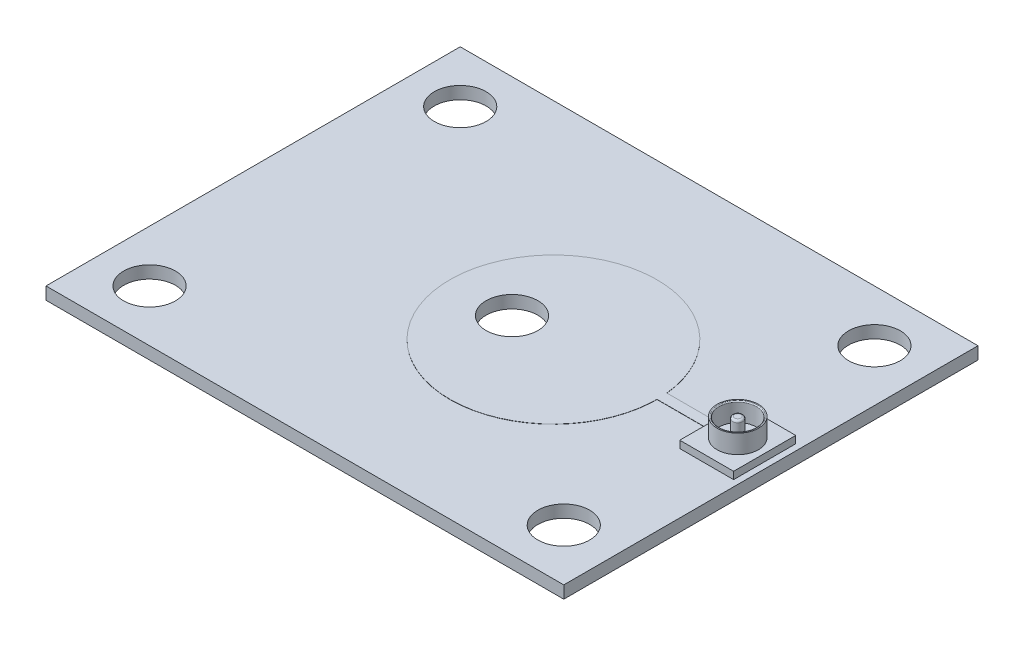
ISO-10303-21;
HEADER;
FILE_DESCRIPTION(('STEP AP214'),'2;1');
FILE_NAME('part.step','',(''),(''),'','','');
FILE_SCHEMA(('AUTOMOTIVE_DESIGN { 1 0 10303 214 1 1 1 1 }'));
ENDSEC;
DATA;
#1=APPLICATION_CONTEXT('core data for automotive mechanical design processes');
#2=APPLICATION_PROTOCOL_DEFINITION('international standard','automotive_design',2000,#1);
#3=PRODUCT_CONTEXT('',#1,'mechanical');
#4=PRODUCT('Part','Part','',(#3));
#5=PRODUCT_RELATED_PRODUCT_CATEGORY('part','',(#4));
#6=PRODUCT_DEFINITION_FORMATION('','',#4);
#7=PRODUCT_DEFINITION_CONTEXT('part definition',#1,'design');
#8=PRODUCT_DEFINITION('design','',#6,#7);
#9=PRODUCT_DEFINITION_SHAPE('','',#8);
#10=(LENGTH_UNIT() NAMED_UNIT(*) SI_UNIT(.MILLI.,.METRE.));
#11=(NAMED_UNIT(*) PLANE_ANGLE_UNIT() SI_UNIT($,.RADIAN.));
#12=(NAMED_UNIT(*) SI_UNIT($,.STERADIAN.) SOLID_ANGLE_UNIT());
#13=UNCERTAINTY_MEASURE_WITH_UNIT(LENGTH_MEASURE(1.E-05),#10,'distance_accuracy_value','');
#14=(GEOMETRIC_REPRESENTATION_CONTEXT(3) GLOBAL_UNCERTAINTY_ASSIGNED_CONTEXT((#13)) GLOBAL_UNIT_ASSIGNED_CONTEXT((#10,
#11,#12)) REPRESENTATION_CONTEXT('',''));
#15=CARTESIAN_POINT('',(0.,0.,0.));
#16=DIRECTION('',(0.,0.,1.));
#17=DIRECTION('',(1.,0.,0.));
#18=AXIS2_PLACEMENT_3D('',#15,#16,#17);
#19=CARTESIAN_POINT('',(0.,0.6,0.));
#20=DIRECTION('',(0.,-1.,0.));
#21=DIRECTION('',(0.,0.,-1.));
#22=AXIS2_PLACEMENT_3D('',#19,#20,#21);
#23=PLANE('',#22);
#24=CARTESIAN_POINT('',(-10.,0.6,7.5));
#25=DIRECTION('',(0.,1.,0.));
#26=DIRECTION('',(0.,0.,-1.));
#27=AXIS2_PLACEMENT_3D('',#24,#25,#26);
#28=CIRCLE('',#27,1.25);
#29=CARTESIAN_POINT('',(-10.,0.6,6.25));
#30=VERTEX_POINT('',#29);
#31=EDGE_CURVE('E224',#30,#30,#28,.T.);
#32=ORIENTED_EDGE('',*,*,#31,.F.);
#33=EDGE_LOOP('',(#32));
#34=FACE_BOUND('',#33,.T.);
#35=CARTESIAN_POINT('',(10.,0.6,7.5));
#36=DIRECTION('',(0.,1.,0.));
#37=DIRECTION('',(0.,0.,1.));
#38=AXIS2_PLACEMENT_3D('',#35,#36,#37);
#39=CIRCLE('',#38,1.25);
#40=CARTESIAN_POINT('',(10.,0.6,8.75));
#41=VERTEX_POINT('',#40);
#42=EDGE_CURVE('E238',#41,#41,#39,.T.);
#43=ORIENTED_EDGE('',*,*,#42,.F.);
#44=EDGE_LOOP('',(#43));
#45=FACE_BOUND('',#44,.T.);
#46=CARTESIAN_POINT('',(10.,0.6,-7.5));
#47=DIRECTION('',(0.,1.,0.));
#48=DIRECTION('',(0.,0.,-1.));
#49=AXIS2_PLACEMENT_3D('',#46,#47,#48);
#50=CIRCLE('',#49,1.25);
#51=CARTESIAN_POINT('',(10.,0.6,-8.75));
#52=VERTEX_POINT('',#51);
#53=EDGE_CURVE('E232',#52,#52,#50,.T.);
#54=ORIENTED_EDGE('',*,*,#53,.F.);
#55=EDGE_LOOP('',(#54));
#56=FACE_BOUND('',#55,.T.);
#57=CARTESIAN_POINT('',(-10.,0.6,-7.5));
#58=DIRECTION('',(0.,1.,0.));
#59=DIRECTION('',(0.,0.,1.));
#60=AXIS2_PLACEMENT_3D('',#57,#58,#59);
#61=CIRCLE('',#60,1.25);
#62=CARTESIAN_POINT('',(-10.,0.6,-6.25));
#63=VERTEX_POINT('',#62);
#64=EDGE_CURVE('E228',#63,#63,#61,.T.);
#65=ORIENTED_EDGE('',*,*,#64,.F.);
#66=EDGE_LOOP('',(#65));
#67=FACE_BOUND('',#66,.T.);
#68=DIRECTION('',(0.,0.,-1.));
#69=VECTOR('',#68,1.);
#70=CARTESIAN_POINT('',(12.5,0.6,10.));
#71=LINE('',#70,#69);
#72=CARTESIAN_POINT('',(12.5,0.6,10.));
#73=VERTEX_POINT('',#72);
#74=CARTESIAN_POINT('',(12.5,0.6,-10.));
#75=VERTEX_POINT('',#74);
#76=EDGE_CURVE('E252',#73,#75,#71,.T.);
#77=ORIENTED_EDGE('',*,*,#76,.T.);
#78=DIRECTION('',(-1.,0.,0.));
#79=VECTOR('',#78,1.);
#80=CARTESIAN_POINT('',(-12.5,0.6,-10.));
#81=LINE('',#80,#79);
#82=CARTESIAN_POINT('',(-12.5,0.6,-10.));
#83=VERTEX_POINT('',#82);
#84=EDGE_CURVE('E255',#75,#83,#81,.T.);
#85=ORIENTED_EDGE('',*,*,#84,.T.);
#86=DIRECTION('',(0.,0.,1.));
#87=VECTOR('',#86,1.);
#88=CARTESIAN_POINT('',(-12.5,0.6,10.));
#89=LINE('',#88,#87);
#90=CARTESIAN_POINT('',(-12.5,0.6,10.));
#91=VERTEX_POINT('',#90);
#92=EDGE_CURVE('E258',#83,#91,#89,.T.);
#93=ORIENTED_EDGE('',*,*,#92,.T.);
#94=DIRECTION('',(1.,0.,0.));
#95=VECTOR('',#94,1.);
#96=CARTESIAN_POINT('',(-12.5,0.6,10.));
#97=LINE('',#96,#95);
#98=EDGE_CURVE('E260',#91,#73,#97,.T.);
#99=ORIENTED_EDGE('',*,*,#98,.T.);
#100=EDGE_LOOP('',(#77,#85,#93,#99));
#101=FACE_BOUND('',#100,.T.);
#102=DIRECTION('',(0.,0.,1.));
#103=VECTOR('',#102,1.);
#104=CARTESIAN_POINT('',(9.6,0.6,1.5));
#105=LINE('',#104,#103);
#106=CARTESIAN_POINT('',(9.6,0.6,0.));
#107=VERTEX_POINT('',#106);
#108=CARTESIAN_POINT('',(9.6,0.6,1.5));
#109=VERTEX_POINT('',#108);
#110=EDGE_CURVE('E60',#107,#109,#105,.T.);
#111=ORIENTED_EDGE('',*,*,#110,.F.);
#112=DIRECTION('',(-1.,0.,0.));
#113=VECTOR('',#112,1.);
#114=CARTESIAN_POINT('',(0.,0.6,0.));
#115=LINE('',#114,#113);
#116=CARTESIAN_POINT('',(7.,0.6,0.));
#117=VERTEX_POINT('',#116);
#118=EDGE_CURVE('E164',#107,#117,#115,.T.);
#119=ORIENTED_EDGE('',*,*,#118,.T.);
#120=DIRECTION('',(-0.0299999999999982,0.,0.999549898704412));
#121=VECTOR('',#120,1.);
#122=CARTESIAN_POINT('',(6.9937,0.6,0.209905478727914));
#123=LINE('',#122,#121);
#124=CARTESIAN_POINT('',(6.991,0.6,0.299864969611323));
#125=VERTEX_POINT('',#124);
#126=EDGE_CURVE('E140',#117,#125,#123,.T.);
#127=ORIENTED_EDGE('',*,*,#126,.T.);
#128=CARTESIAN_POINT('',(2.,0.6,0.));
#129=DIRECTION('',(0.,1.,0.));
#130=DIRECTION('',(0.,0.,1.));
#131=AXIS2_PLACEMENT_3D('',#128,#129,#130);
#132=CIRCLE('',#131,5.);
#133=CARTESIAN_POINT('',(6.9749371855331,0.6,-0.5));
#134=VERTEX_POINT('',#133);
#135=EDGE_CURVE('E169',#134,#125,#132,.T.);
#136=ORIENTED_EDGE('',*,*,#135,.F.);
#137=DIRECTION('',(-1.,0.,0.));
#138=VECTOR('',#137,1.);
#139=CARTESIAN_POINT('',(0.,0.6,-0.5));
#140=LINE('',#139,#138);
#141=CARTESIAN_POINT('',(9.6,0.6,-0.5));
#142=VERTEX_POINT('',#141);
#143=EDGE_CURVE('E166',#142,#134,#140,.T.);
#144=ORIENTED_EDGE('',*,*,#143,.F.);
#145=CARTESIAN_POINT('',(9.6,0.6,-1.5));
#146=VERTEX_POINT('',#145);
#147=EDGE_CURVE('E202',#146,#142,#105,.T.);
#148=ORIENTED_EDGE('',*,*,#147,.F.);
#149=DIRECTION('',(-1.,0.,0.));
#150=VECTOR('',#149,1.);
#151=CARTESIAN_POINT('',(12.2,0.6,-1.5));
#152=LINE('',#151,#150);
#153=CARTESIAN_POINT('',(12.2,0.6,-1.5));
#154=VERTEX_POINT('',#153);
#155=EDGE_CURVE('E195',#154,#146,#152,.T.);
#156=ORIENTED_EDGE('',*,*,#155,.F.);
#157=DIRECTION('',(0.,0.,-1.));
#158=VECTOR('',#157,1.);
#159=CARTESIAN_POINT('',(12.2,0.6,1.5));
#160=LINE('',#159,#158);
#161=CARTESIAN_POINT('',(12.2,0.6,1.5));
#162=VERTEX_POINT('',#161);
#163=EDGE_CURVE('E208',#162,#154,#160,.T.);
#164=ORIENTED_EDGE('',*,*,#163,.F.);
#165=DIRECTION('',(1.,0.,0.));
#166=VECTOR('',#165,1.);
#167=CARTESIAN_POINT('',(12.2,0.6,1.5));
#168=LINE('',#167,#166);
#169=EDGE_CURVE('E205',#109,#162,#168,.T.);
#170=ORIENTED_EDGE('',*,*,#169,.F.);
#171=EDGE_LOOP('',(#111,#119,#127,#136,#144,#148,#156,#164,#170));
#172=FACE_BOUND('',#171,.T.);
#173=ADVANCED_FACE('F37',(#34,#45,#56,#67,#101,#172),#23,.F.);
#174=CARTESIAN_POINT('',(12.5,0.6,10.));
#175=DIRECTION('',(-1.,0.,0.));
#176=DIRECTION('',(0.,0.,1.));
#177=AXIS2_PLACEMENT_3D('',#174,#175,#176);
#178=PLANE('',#177);
#179=DIRECTION('',(0.,0.,-1.));
#180=VECTOR('',#179,1.);
#181=CARTESIAN_POINT('',(12.5,0.,10.));
#182=LINE('',#181,#180);
#183=CARTESIAN_POINT('',(12.5,0.,10.));
#184=VERTEX_POINT('',#183);
#185=CARTESIAN_POINT('',(12.5,0.,-10.));
#186=VERTEX_POINT('',#185);
#187=EDGE_CURVE('E249',#184,#186,#182,.T.);
#188=ORIENTED_EDGE('',*,*,#187,.T.);
#189=DIRECTION('',(0.,-1.,0.));
#190=VECTOR('',#189,1.);
#191=CARTESIAN_POINT('',(12.5,0.6,-10.));
#192=LINE('',#191,#190);
#193=EDGE_CURVE('E190',#75,#186,#192,.T.);
#194=ORIENTED_EDGE('',*,*,#193,.F.);
#195=ORIENTED_EDGE('',*,*,#76,.F.);
#196=DIRECTION('',(0.,-1.,0.));
#197=VECTOR('',#196,1.);
#198=CARTESIAN_POINT('',(12.5,0.6,10.));
#199=LINE('',#198,#197);
#200=EDGE_CURVE('E262',#73,#184,#199,.T.);
#201=ORIENTED_EDGE('',*,*,#200,.T.);
#202=EDGE_LOOP('',(#188,#194,#195,#201));
#203=FACE_BOUND('',#202,.T.);
#204=ADVANCED_FACE('F302',(#203),#178,.F.);
#205=CARTESIAN_POINT('',(-12.5,0.6,-10.));
#206=DIRECTION('',(0.,0.,1.));
#207=DIRECTION('',(1.,0.,0.));
#208=AXIS2_PLACEMENT_3D('',#205,#206,#207);
#209=PLANE('',#208);
#210=DIRECTION('',(-1.,0.,0.));
#211=VECTOR('',#210,1.);
#212=CARTESIAN_POINT('',(-12.5,0.,-10.));
#213=LINE('',#212,#211);
#214=CARTESIAN_POINT('',(-12.5,0.,-10.));
#215=VERTEX_POINT('',#214);
#216=EDGE_CURVE('E265',#186,#215,#213,.T.);
#217=ORIENTED_EDGE('',*,*,#216,.T.);
#218=DIRECTION('',(0.,-1.,0.));
#219=VECTOR('',#218,1.);
#220=CARTESIAN_POINT('',(-12.5,0.6,-10.));
#221=LINE('',#220,#219);
#222=EDGE_CURVE('E275',#83,#215,#221,.T.);
#223=ORIENTED_EDGE('',*,*,#222,.F.);
#224=ORIENTED_EDGE('',*,*,#84,.F.);
#225=ORIENTED_EDGE('',*,*,#193,.T.);
#226=EDGE_LOOP('',(#217,#223,#224,#225));
#227=FACE_BOUND('',#226,.T.);
#228=ADVANCED_FACE('F308',(#227),#209,.F.);
#229=CARTESIAN_POINT('',(-12.5,0.6,10.));
#230=DIRECTION('',(1.,0.,0.));
#231=DIRECTION('',(0.,0.,-1.));
#232=AXIS2_PLACEMENT_3D('',#229,#230,#231);
#233=PLANE('',#232);
#234=DIRECTION('',(0.,0.,1.));
#235=VECTOR('',#234,1.);
#236=CARTESIAN_POINT('',(-12.5,0.,10.));
#237=LINE('',#236,#235);
#238=CARTESIAN_POINT('',(-12.5,0.,10.));
#239=VERTEX_POINT('',#238);
#240=EDGE_CURVE('E267',#215,#239,#237,.T.);
#241=ORIENTED_EDGE('',*,*,#240,.T.);
#242=DIRECTION('',(0.,-1.,0.));
#243=VECTOR('',#242,1.);
#244=CARTESIAN_POINT('',(-12.5,0.6,10.));
#245=LINE('',#244,#243);
#246=EDGE_CURVE('E272',#91,#239,#245,.T.);
#247=ORIENTED_EDGE('',*,*,#246,.F.);
#248=ORIENTED_EDGE('',*,*,#92,.F.);
#249=ORIENTED_EDGE('',*,*,#222,.T.);
#250=EDGE_LOOP('',(#241,#247,#248,#249));
#251=FACE_BOUND('',#250,.T.);
#252=ADVANCED_FACE('F324',(#251),#233,.F.);
#253=CARTESIAN_POINT('',(-12.5,0.6,10.));
#254=DIRECTION('',(0.,0.,-1.));
#255=DIRECTION('',(-1.,0.,0.));
#256=AXIS2_PLACEMENT_3D('',#253,#254,#255);
#257=PLANE('',#256);
#258=DIRECTION('',(1.,0.,0.));
#259=VECTOR('',#258,1.);
#260=CARTESIAN_POINT('',(-12.5,0.,10.));
#261=LINE('',#260,#259);
#262=EDGE_CURVE('E256',#239,#184,#261,.T.);
#263=ORIENTED_EDGE('',*,*,#262,.T.);
#264=ORIENTED_EDGE('',*,*,#200,.F.);
#265=ORIENTED_EDGE('',*,*,#98,.F.);
#266=ORIENTED_EDGE('',*,*,#246,.T.);
#267=EDGE_LOOP('',(#263,#264,#265,#266));
#268=FACE_BOUND('',#267,.T.);
#269=ADVANCED_FACE('F320',(#268),#257,.F.);
#270=CARTESIAN_POINT('',(0.,0.,0.));
#271=DIRECTION('',(0.,-1.,0.));
#272=DIRECTION('',(0.,0.,-1.));
#273=AXIS2_PLACEMENT_3D('',#270,#271,#272);
#274=PLANE('',#273);
#275=CARTESIAN_POINT('',(-10.,0.,7.5));
#276=DIRECTION('',(0.,1.,0.));
#277=DIRECTION('',(0.,0.,-1.));
#278=AXIS2_PLACEMENT_3D('',#275,#276,#277);
#279=CIRCLE('',#278,1.25);
#280=CARTESIAN_POINT('',(-10.,0.,6.25));
#281=VERTEX_POINT('',#280);
#282=EDGE_CURVE('E241',#281,#281,#279,.T.);
#283=ORIENTED_EDGE('',*,*,#282,.T.);
#284=EDGE_LOOP('',(#283));
#285=FACE_BOUND('',#284,.T.);
#286=CARTESIAN_POINT('',(10.,0.,7.5));
#287=DIRECTION('',(0.,1.,0.));
#288=DIRECTION('',(0.,0.,1.));
#289=AXIS2_PLACEMENT_3D('',#286,#287,#288);
#290=CIRCLE('',#289,1.25);
#291=CARTESIAN_POINT('',(10.,0.,8.75));
#292=VERTEX_POINT('',#291);
#293=EDGE_CURVE('E235',#292,#292,#290,.T.);
#294=ORIENTED_EDGE('',*,*,#293,.T.);
#295=EDGE_LOOP('',(#294));
#296=FACE_BOUND('',#295,.T.);
#297=CARTESIAN_POINT('',(10.,0.,-7.5));
#298=DIRECTION('',(0.,1.,0.));
#299=DIRECTION('',(0.,0.,-1.));
#300=AXIS2_PLACEMENT_3D('',#297,#298,#299);
#301=CIRCLE('',#300,1.25);
#302=CARTESIAN_POINT('',(10.,0.,-8.75));
#303=VERTEX_POINT('',#302);
#304=EDGE_CURVE('E229',#303,#303,#301,.T.);
#305=ORIENTED_EDGE('',*,*,#304,.T.);
#306=EDGE_LOOP('',(#305));
#307=FACE_BOUND('',#306,.T.);
#308=CARTESIAN_POINT('',(0.,0.,0.));
#309=DIRECTION('',(0.,1.,0.));
#310=DIRECTION('',(0.,0.,1.));
#311=AXIS2_PLACEMENT_3D('',#308,#309,#310);
#312=CIRCLE('',#311,1.25);
#313=CARTESIAN_POINT('',(0.,0.,1.25));
#314=VERTEX_POINT('',#313);
#315=EDGE_CURVE('E225',#314,#314,#312,.T.);
#316=ORIENTED_EDGE('',*,*,#315,.T.);
#317=EDGE_LOOP('',(#316));
#318=FACE_BOUND('',#317,.T.);
#319=CARTESIAN_POINT('',(-10.,0.,-7.5));
#320=DIRECTION('',(0.,1.,0.));
#321=DIRECTION('',(0.,0.,1.));
#322=AXIS2_PLACEMENT_3D('',#319,#320,#321);
#323=CIRCLE('',#322,1.25);
#324=CARTESIAN_POINT('',(-10.,0.,-6.25));
#325=VERTEX_POINT('',#324);
#326=EDGE_CURVE('E246',#325,#325,#323,.T.);
#327=ORIENTED_EDGE('',*,*,#326,.T.);
#328=EDGE_LOOP('',(#327));
#329=FACE_BOUND('',#328,.T.);
#330=ORIENTED_EDGE('',*,*,#187,.F.);
#331=ORIENTED_EDGE('',*,*,#262,.F.);
#332=ORIENTED_EDGE('',*,*,#240,.F.);
#333=ORIENTED_EDGE('',*,*,#216,.F.);
#334=EDGE_LOOP('',(#330,#331,#332,#333));
#335=FACE_BOUND('',#334,.T.);
#336=ADVANCED_FACE('F317',(#285,#296,#307,#318,#329,#335),#274,.T.);
#337=CARTESIAN_POINT('',(-10.,0.,-7.5));
#338=DIRECTION('',(0.,1.,0.));
#339=DIRECTION('',(0.,0.,1.));
#340=AXIS2_PLACEMENT_3D('',#337,#338,#339);
#341=CYLINDRICAL_SURFACE('',#340,1.25);
#342=ORIENTED_EDGE('',*,*,#326,.F.);
#343=EDGE_LOOP('',(#342));
#344=FACE_BOUND('',#343,.T.);
#345=ORIENTED_EDGE('',*,*,#64,.T.);
#346=EDGE_LOOP('',(#345));
#347=FACE_BOUND('',#346,.T.);
#348=ADVANCED_FACE('F315',(#344,#347),#341,.F.);
#349=CARTESIAN_POINT('',(0.,0.,0.));
#350=DIRECTION('',(0.,1.,0.));
#351=DIRECTION('',(0.,0.,1.));
#352=AXIS2_PLACEMENT_3D('',#349,#350,#351);
#353=CYLINDRICAL_SURFACE('',#352,1.25);
#354=ORIENTED_EDGE('',*,*,#315,.F.);
#355=EDGE_LOOP('',(#354));
#356=FACE_BOUND('',#355,.T.);
#357=CARTESIAN_POINT('',(0.,0.61,0.));
#358=DIRECTION('',(0.,1.,0.));
#359=DIRECTION('',(0.,0.,1.));
#360=AXIS2_PLACEMENT_3D('',#357,#358,#359);
#361=CIRCLE('',#360,1.25);
#362=CARTESIAN_POINT('',(0.,0.61,1.25));
#363=VERTEX_POINT('',#362);
#364=EDGE_CURVE('E150',#363,#363,#361,.F.);
#365=ORIENTED_EDGE('',*,*,#364,.F.);
#366=EDGE_LOOP('',(#365));
#367=FACE_BOUND('',#366,.T.);
#368=ADVANCED_FACE('F375',(#356,#367),#353,.F.);
#369=CARTESIAN_POINT('',(10.,0.,-7.5));
#370=DIRECTION('',(0.,1.,0.));
#371=DIRECTION('',(0.,0.,1.));
#372=AXIS2_PLACEMENT_3D('',#369,#370,#371);
#373=CYLINDRICAL_SURFACE('',#372,1.25);
#374=ORIENTED_EDGE('',*,*,#304,.F.);
#375=EDGE_LOOP('',(#374));
#376=FACE_BOUND('',#375,.T.);
#377=ORIENTED_EDGE('',*,*,#53,.T.);
#378=EDGE_LOOP('',(#377));
#379=FACE_BOUND('',#378,.T.);
#380=ADVANCED_FACE('F378',(#376,#379),#373,.F.);
#381=CARTESIAN_POINT('',(10.,0.,7.5));
#382=DIRECTION('',(0.,1.,0.));
#383=DIRECTION('',(0.,0.,1.));
#384=AXIS2_PLACEMENT_3D('',#381,#382,#383);
#385=CYLINDRICAL_SURFACE('',#384,1.25);
#386=ORIENTED_EDGE('',*,*,#293,.F.);
#387=EDGE_LOOP('',(#386));
#388=FACE_BOUND('',#387,.T.);
#389=ORIENTED_EDGE('',*,*,#42,.T.);
#390=EDGE_LOOP('',(#389));
#391=FACE_BOUND('',#390,.T.);
#392=ADVANCED_FACE('F382',(#388,#391),#385,.F.);
#393=CARTESIAN_POINT('',(-10.,0.,7.5));
#394=DIRECTION('',(0.,1.,0.));
#395=DIRECTION('',(0.,0.,1.));
#396=AXIS2_PLACEMENT_3D('',#393,#394,#395);
#397=CYLINDRICAL_SURFACE('',#396,1.25);
#398=ORIENTED_EDGE('',*,*,#282,.F.);
#399=EDGE_LOOP('',(#398));
#400=FACE_BOUND('',#399,.T.);
#401=ORIENTED_EDGE('',*,*,#31,.T.);
#402=EDGE_LOOP('',(#401));
#403=FACE_BOUND('',#402,.T.);
#404=ADVANCED_FACE('F374',(#400,#403),#397,.F.);
#405=CARTESIAN_POINT('',(9.6,0.95,1.5));
#406=DIRECTION('',(1.,0.,0.));
#407=DIRECTION('',(0.,0.,-1.));
#408=AXIS2_PLACEMENT_3D('',#405,#406,#407);
#409=PLANE('',#408);
#410=DIRECTION('',(0.,0.,-1.));
#411=VECTOR('',#410,1.);
#412=CARTESIAN_POINT('',(9.6,0.61,0.));
#413=LINE('',#412,#411);
#414=CARTESIAN_POINT('',(9.6,0.61,0.));
#415=VERTEX_POINT('',#414);
#416=CARTESIAN_POINT('',(9.6,0.61,-0.5));
#417=VERTEX_POINT('',#416);
#418=EDGE_CURVE('E154',#415,#417,#413,.T.);
#419=ORIENTED_EDGE('',*,*,#418,.F.);
#420=DIRECTION('',(0.,-1.,0.));
#421=VECTOR('',#420,1.);
#422=CARTESIAN_POINT('',(9.6,0.61,0.));
#423=LINE('',#422,#421);
#424=EDGE_CURVE('E144',#415,#107,#423,.T.);
#425=ORIENTED_EDGE('',*,*,#424,.T.);
#426=ORIENTED_EDGE('',*,*,#110,.T.);
#427=DIRECTION('',(0.,-1.,0.));
#428=VECTOR('',#427,1.);
#429=CARTESIAN_POINT('',(9.6,0.95,1.5));
#430=LINE('',#429,#428);
#431=CARTESIAN_POINT('',(9.6,0.95,1.5));
#432=VERTEX_POINT('',#431);
#433=EDGE_CURVE('E221',#432,#109,#430,.T.);
#434=ORIENTED_EDGE('',*,*,#433,.F.);
#435=DIRECTION('',(0.,0.,1.));
#436=VECTOR('',#435,1.);
#437=CARTESIAN_POINT('',(9.6,0.95,1.5));
#438=LINE('',#437,#436);
#439=CARTESIAN_POINT('',(9.6,0.95,-1.5));
#440=VERTEX_POINT('',#439);
#441=EDGE_CURVE('E191',#440,#432,#438,.T.);
#442=ORIENTED_EDGE('',*,*,#441,.F.);
#443=DIRECTION('',(0.,-1.,0.));
#444=VECTOR('',#443,1.);
#445=CARTESIAN_POINT('',(9.6,0.95,-1.5));
#446=LINE('',#445,#444);
#447=EDGE_CURVE('E201',#440,#146,#446,.T.);
#448=ORIENTED_EDGE('',*,*,#447,.T.);
#449=ORIENTED_EDGE('',*,*,#147,.T.);
#450=DIRECTION('',(0.,-1.,0.));
#451=VECTOR('',#450,1.);
#452=CARTESIAN_POINT('',(9.6,0.61,-0.5));
#453=LINE('',#452,#451);
#454=EDGE_CURVE('E175',#417,#142,#453,.T.);
#455=ORIENTED_EDGE('',*,*,#454,.F.);
#456=EDGE_LOOP('',(#419,#425,#426,#434,#442,#448,#449,#455));
#457=FACE_BOUND('',#456,.T.);
#458=ADVANCED_FACE('F350',(#457),#409,.F.);
#459=CARTESIAN_POINT('',(12.2,0.95,1.5));
#460=DIRECTION('',(0.,0.,-1.));
#461=DIRECTION('',(-1.,0.,0.));
#462=AXIS2_PLACEMENT_3D('',#459,#460,#461);
#463=PLANE('',#462);
#464=ORIENTED_EDGE('',*,*,#169,.T.);
#465=DIRECTION('',(0.,-1.,0.));
#466=VECTOR('',#465,1.);
#467=CARTESIAN_POINT('',(12.2,0.95,1.5));
#468=LINE('',#467,#466);
#469=CARTESIAN_POINT('',(12.2,0.95,1.5));
#470=VERTEX_POINT('',#469);
#471=EDGE_CURVE('E218',#470,#162,#468,.T.);
#472=ORIENTED_EDGE('',*,*,#471,.F.);
#473=DIRECTION('',(1.,0.,0.));
#474=VECTOR('',#473,1.);
#475=CARTESIAN_POINT('',(12.2,0.95,1.5));
#476=LINE('',#475,#474);
#477=EDGE_CURVE('E194',#432,#470,#476,.T.);
#478=ORIENTED_EDGE('',*,*,#477,.F.);
#479=ORIENTED_EDGE('',*,*,#433,.T.);
#480=EDGE_LOOP('',(#464,#472,#478,#479));
#481=FACE_BOUND('',#480,.T.);
#482=ADVANCED_FACE('F348',(#481),#463,.F.);
#483=CARTESIAN_POINT('',(12.2,0.95,1.5));
#484=DIRECTION('',(-1.,0.,0.));
#485=DIRECTION('',(0.,0.,1.));
#486=AXIS2_PLACEMENT_3D('',#483,#484,#485);
#487=PLANE('',#486);
#488=ORIENTED_EDGE('',*,*,#163,.T.);
#489=DIRECTION('',(0.,-1.,0.));
#490=VECTOR('',#489,1.);
#491=CARTESIAN_POINT('',(12.2,0.95,-1.5));
#492=LINE('',#491,#490);
#493=CARTESIAN_POINT('',(12.2,0.95,-1.5));
#494=VERTEX_POINT('',#493);
#495=EDGE_CURVE('E215',#494,#154,#492,.T.);
#496=ORIENTED_EDGE('',*,*,#495,.F.);
#497=DIRECTION('',(0.,0.,-1.));
#498=VECTOR('',#497,1.);
#499=CARTESIAN_POINT('',(12.2,0.95,1.5));
#500=LINE('',#499,#498);
#501=EDGE_CURVE('E197',#470,#494,#500,.T.);
#502=ORIENTED_EDGE('',*,*,#501,.F.);
#503=ORIENTED_EDGE('',*,*,#471,.T.);
#504=EDGE_LOOP('',(#488,#496,#502,#503));
#505=FACE_BOUND('',#504,.T.);
#506=ADVANCED_FACE('F361',(#505),#487,.F.);
#507=CARTESIAN_POINT('',(12.2,0.95,-1.5));
#508=DIRECTION('',(0.,0.,1.));
#509=DIRECTION('',(1.,0.,0.));
#510=AXIS2_PLACEMENT_3D('',#507,#508,#509);
#511=PLANE('',#510);
#512=ORIENTED_EDGE('',*,*,#155,.T.);
#513=ORIENTED_EDGE('',*,*,#447,.F.);
#514=DIRECTION('',(-1.,0.,0.));
#515=VECTOR('',#514,1.);
#516=CARTESIAN_POINT('',(12.2,0.95,-1.5));
#517=LINE('',#516,#515);
#518=EDGE_CURVE('E199',#494,#440,#517,.T.);
#519=ORIENTED_EDGE('',*,*,#518,.F.);
#520=ORIENTED_EDGE('',*,*,#495,.T.);
#521=EDGE_LOOP('',(#512,#513,#519,#520));
#522=FACE_BOUND('',#521,.T.);
#523=ADVANCED_FACE('F358',(#522),#511,.F.);
#524=CARTESIAN_POINT('',(0.,0.95,0.));
#525=DIRECTION('',(0.,1.,0.));
#526=DIRECTION('',(0.,0.,1.));
#527=AXIS2_PLACEMENT_3D('',#524,#525,#526);
#528=PLANE('',#527);
#529=CARTESIAN_POINT('',(10.9,0.95,0.));
#530=DIRECTION('',(0.,1.,0.));
#531=DIRECTION('',(0.,0.,1.));
#532=AXIS2_PLACEMENT_3D('',#529,#530,#531);
#533=CIRCLE('',#532,1.);
#534=CARTESIAN_POINT('',(10.9,0.95,1.));
#535=VERTEX_POINT('',#534);
#536=EDGE_CURVE('E186',#535,#535,#533,.T.);
#537=ORIENTED_EDGE('',*,*,#536,.F.);
#538=EDGE_LOOP('',(#537));
#539=FACE_BOUND('',#538,.T.);
#540=ORIENTED_EDGE('',*,*,#441,.T.);
#541=ORIENTED_EDGE('',*,*,#477,.T.);
#542=ORIENTED_EDGE('',*,*,#501,.T.);
#543=ORIENTED_EDGE('',*,*,#518,.T.);
#544=EDGE_LOOP('',(#540,#541,#542,#543));
#545=FACE_BOUND('',#544,.T.);
#546=ADVANCED_FACE('F353',(#539,#545),#528,.T.);
#547=CARTESIAN_POINT('',(10.9,1.85,0.));
#548=DIRECTION('',(0.,-1.,0.));
#549=DIRECTION('',(0.,0.,-1.));
#550=AXIS2_PLACEMENT_3D('',#547,#548,#549);
#551=CYLINDRICAL_SURFACE('',#550,1.);
#552=CARTESIAN_POINT('',(10.9,1.85,0.));
#553=DIRECTION('',(0.,1.,0.));
#554=DIRECTION('',(0.,0.,1.));
#555=AXIS2_PLACEMENT_3D('',#552,#553,#554);
#556=CIRCLE('',#555,1.);
#557=CARTESIAN_POINT('',(10.9,1.85,1.));
#558=VERTEX_POINT('',#557);
#559=EDGE_CURVE('E183',#558,#558,#556,.T.);
#560=ORIENTED_EDGE('',*,*,#559,.F.);
#561=EDGE_LOOP('',(#560));
#562=FACE_BOUND('',#561,.T.);
#563=ORIENTED_EDGE('',*,*,#536,.T.);
#564=EDGE_LOOP('',(#563));
#565=FACE_BOUND('',#564,.T.);
#566=ADVANCED_FACE('F452',(#562,#565),#551,.T.);
#567=CARTESIAN_POINT('',(10.9,1.85,0.));
#568=DIRECTION('',(0.,1.,0.));
#569=DIRECTION('',(0.,0.,1.));
#570=AXIS2_PLACEMENT_3D('',#567,#568,#569);
#571=PLANE('',#570);
#572=CARTESIAN_POINT('',(10.9,1.85,0.));
#573=DIRECTION('',(0.,1.,0.));
#574=DIRECTION('',(0.,0.,1.));
#575=AXIS2_PLACEMENT_3D('',#572,#573,#574);
#576=CIRCLE('',#575,0.95);
#577=CARTESIAN_POINT('',(10.9,1.85,0.949999999999999));
#578=VERTEX_POINT('',#577);
#579=EDGE_CURVE('E11',#578,#578,#576,.F.);
#580=ORIENTED_EDGE('',*,*,#579,.T.);
#581=EDGE_LOOP('',(#580));
#582=FACE_BOUND('',#581,.T.);
#583=ORIENTED_EDGE('',*,*,#559,.T.);
#584=EDGE_LOOP('',(#583));
#585=FACE_BOUND('',#584,.T.);
#586=ADVANCED_FACE('F461',(#582,#585),#571,.T.);
#587=CARTESIAN_POINT('',(10.9,0.95,0.));
#588=DIRECTION('',(0.,1.,0.));
#589=DIRECTION('',(0.,0.,1.));
#590=AXIS2_PLACEMENT_3D('',#587,#588,#589);
#591=CYLINDRICAL_SURFACE('',#590,0.9);
#592=CARTESIAN_POINT('',(10.9,1.8,0.));
#593=DIRECTION('',(0.,1.,0.));
#594=DIRECTION('',(0.,0.,1.));
#595=AXIS2_PLACEMENT_3D('',#592,#593,#594);
#596=CIRCLE('',#595,0.9);
#597=CARTESIAN_POINT('',(10.9,1.8,0.899999999999999));
#598=VERTEX_POINT('',#597);
#599=EDGE_CURVE('E45',#598,#598,#596,.T.);
#600=ORIENTED_EDGE('',*,*,#599,.T.);
#601=EDGE_LOOP('',(#600));
#602=FACE_BOUND('',#601,.T.);
#603=CARTESIAN_POINT('',(10.9,0.95,0.));
#604=DIRECTION('',(0.,1.,0.));
#605=DIRECTION('',(0.,0.,1.));
#606=AXIS2_PLACEMENT_3D('',#603,#604,#605);
#607=CIRCLE('',#606,0.9);
#608=CARTESIAN_POINT('',(10.9,0.95,0.899999999999999));
#609=VERTEX_POINT('',#608);
#610=EDGE_CURVE('E180',#609,#609,#607,.T.);
#611=ORIENTED_EDGE('',*,*,#610,.F.);
#612=EDGE_LOOP('',(#611));
#613=FACE_BOUND('',#612,.T.);
#614=ADVANCED_FACE('F287',(#602,#613),#591,.F.);
#615=CARTESIAN_POINT('',(10.9,0.95,0.));
#616=DIRECTION('',(0.,1.,0.));
#617=DIRECTION('',(0.,0.,1.));
#618=AXIS2_PLACEMENT_3D('',#615,#616,#617);
#619=PLANE('',#618);
#620=CARTESIAN_POINT('',(10.9,0.95,0.));
#621=DIRECTION('',(0.,1.,0.));
#622=DIRECTION('',(0.,0.,1.));
#623=AXIS2_PLACEMENT_3D('',#620,#621,#622);
#624=CIRCLE('',#623,0.25);
#625=CARTESIAN_POINT('',(10.9,0.95,0.249999999999998));
#626=VERTEX_POINT('',#625);
#627=EDGE_CURVE('E143',#626,#626,#624,.T.);
#628=ORIENTED_EDGE('',*,*,#627,.F.);
#629=EDGE_LOOP('',(#628));
#630=FACE_BOUND('',#629,.T.);
#631=ORIENTED_EDGE('',*,*,#610,.T.);
#632=EDGE_LOOP('',(#631));
#633=FACE_BOUND('',#632,.T.);
#634=ADVANCED_FACE('F469',(#630,#633),#619,.T.);
#635=CARTESIAN_POINT('',(10.9,0.95,0.));
#636=DIRECTION('',(0.,1.,0.));
#637=DIRECTION('',(0.,0.,1.));
#638=AXIS2_PLACEMENT_3D('',#635,#636,#637);
#639=CYLINDRICAL_SURFACE('',#638,0.25);
#640=CARTESIAN_POINT('',(10.9,1.75,0.));
#641=DIRECTION('',(0.,1.,0.));
#642=DIRECTION('',(0.,0.,1.));
#643=AXIS2_PLACEMENT_3D('',#640,#641,#642);
#644=CIRCLE('',#643,0.25);
#645=CARTESIAN_POINT('',(10.9,1.75,0.249999999999998));
#646=VERTEX_POINT('',#645);
#647=EDGE_CURVE('E282',#646,#646,#644,.F.);
#648=ORIENTED_EDGE('',*,*,#647,.T.);
#649=EDGE_LOOP('',(#648));
#650=FACE_BOUND('',#649,.T.);
#651=ORIENTED_EDGE('',*,*,#627,.T.);
#652=EDGE_LOOP('',(#651));
#653=FACE_BOUND('',#652,.T.);
#654=ADVANCED_FACE('F475',(#650,#653),#639,.T.);
#655=CARTESIAN_POINT('',(10.9,1.85,0.));
#656=DIRECTION('',(0.,1.,0.));
#657=DIRECTION('',(0.,0.,1.));
#658=AXIS2_PLACEMENT_3D('',#655,#656,#657);
#659=CIRCLE('',#658,0.15);
#660=CARTESIAN_POINT('',(10.9,1.85,0.149999999999998));
#661=VERTEX_POINT('',#660);
#662=EDGE_CURVE('E189',#661,#661,#659,.T.);
#663=ORIENTED_EDGE('',*,*,#662,.T.);
#664=EDGE_LOOP('',(#663));
#665=FACE_BOUND('',#664,.T.);
#666=ADVANCED_FACE('F298',(#665),#571,.T.);
#667=CARTESIAN_POINT('',(10.9,1.75,0.));
#668=DIRECTION('',(0.,1.,0.));
#669=DIRECTION('',(0.,0.,1.));
#670=AXIS2_PLACEMENT_3D('',#667,#668,#669);
#671=TOROIDAL_SURFACE('',#670,0.15,0.1);
#672=ORIENTED_EDGE('',*,*,#647,.F.);
#673=EDGE_LOOP('',(#672));
#674=FACE_BOUND('',#673,.T.);
#675=ORIENTED_EDGE('',*,*,#662,.F.);
#676=EDGE_LOOP('',(#675));
#677=FACE_BOUND('',#676,.T.);
#678=ADVANCED_FACE('F291',(#674,#677),#671,.T.);
#679=CARTESIAN_POINT('',(10.9,1.8,0.));
#680=DIRECTION('',(0.,1.,0.));
#681=DIRECTION('',(0.,0.,1.));
#682=AXIS2_PLACEMENT_3D('',#679,#680,#681);
#683=TOROIDAL_SURFACE('',#682,0.95,0.05);
#684=ORIENTED_EDGE('',*,*,#579,.F.);
#685=EDGE_LOOP('',(#684));
#686=FACE_BOUND('',#685,.T.);
#687=ORIENTED_EDGE('',*,*,#599,.F.);
#688=EDGE_LOOP('',(#687));
#689=FACE_BOUND('',#688,.T.);
#690=ADVANCED_FACE('F39',(#686,#689),#683,.T.);
#691=CARTESIAN_POINT('',(6.9937,0.61,0.209905478727914));
#692=DIRECTION('',(0.999549898704412,0.,0.0299999999999982));
#693=DIRECTION('',(0.0299999999999982,0.,-0.999549898704412));
#694=AXIS2_PLACEMENT_3D('',#691,#692,#693);
#695=PLANE('',#694);
#696=ORIENTED_EDGE('',*,*,#126,.F.);
#697=DIRECTION('',(0.,-1.,0.));
#698=VECTOR('',#697,1.);
#699=CARTESIAN_POINT('',(7.,0.61,0.));
#700=LINE('',#699,#698);
#701=CARTESIAN_POINT('',(7.,0.61,0.));
#702=VERTEX_POINT('',#701);
#703=EDGE_CURVE('E136',#702,#117,#700,.T.);
#704=ORIENTED_EDGE('',*,*,#703,.F.);
#705=DIRECTION('',(-0.0299999999999982,0.,0.999549898704412));
#706=VECTOR('',#705,1.);
#707=CARTESIAN_POINT('',(6.9937,0.61,0.209905478727914));
#708=LINE('',#707,#706);
#709=CARTESIAN_POINT('',(6.991,0.61,0.299864969611323));
#710=VERTEX_POINT('',#709);
#711=EDGE_CURVE('E138',#702,#710,#708,.T.);
#712=ORIENTED_EDGE('',*,*,#711,.T.);
#713=DIRECTION('',(0.,-1.,0.));
#714=VECTOR('',#713,1.);
#715=CARTESIAN_POINT('',(6.991,0.61,0.299864969611323));
#716=LINE('',#715,#714);
#717=EDGE_CURVE('E162',#710,#125,#716,.T.);
#718=ORIENTED_EDGE('',*,*,#717,.T.);
#719=EDGE_LOOP('',(#696,#704,#712,#718));
#720=FACE_BOUND('',#719,.T.);
#721=ADVANCED_FACE('F137',(#720),#695,.T.);
#722=CARTESIAN_POINT('',(0.,0.61,0.));
#723=DIRECTION('',(0.,0.,1.));
#724=DIRECTION('',(1.,0.,0.));
#725=AXIS2_PLACEMENT_3D('',#722,#723,#724);
#726=PLANE('',#725);
#727=ORIENTED_EDGE('',*,*,#118,.F.);
#728=ORIENTED_EDGE('',*,*,#424,.F.);
#729=DIRECTION('',(-1.,0.,0.));
#730=VECTOR('',#729,1.);
#731=CARTESIAN_POINT('',(0.,0.61,0.));
#732=LINE('',#731,#730);
#733=EDGE_CURVE('E52',#415,#702,#732,.T.);
#734=ORIENTED_EDGE('',*,*,#733,.T.);
#735=ORIENTED_EDGE('',*,*,#703,.T.);
#736=EDGE_LOOP('',(#727,#728,#734,#735));
#737=FACE_BOUND('',#736,.T.);
#738=ADVANCED_FACE('F152',(#737),#726,.T.);
#739=CARTESIAN_POINT('',(0.,0.61,-0.5));
#740=DIRECTION('',(0.,0.,1.));
#741=DIRECTION('',(1.,0.,0.));
#742=AXIS2_PLACEMENT_3D('',#739,#740,#741);
#743=PLANE('',#742);
#744=ORIENTED_EDGE('',*,*,#143,.T.);
#745=DIRECTION('',(0.,-1.,0.));
#746=VECTOR('',#745,1.);
#747=CARTESIAN_POINT('',(6.9749371855331,0.61,-0.5));
#748=LINE('',#747,#746);
#749=CARTESIAN_POINT('',(6.9749371855331,0.61,-0.5));
#750=VERTEX_POINT('',#749);
#751=EDGE_CURVE('E173',#750,#134,#748,.T.);
#752=ORIENTED_EDGE('',*,*,#751,.F.);
#753=DIRECTION('',(-1.,0.,0.));
#754=VECTOR('',#753,1.);
#755=CARTESIAN_POINT('',(0.,0.61,-0.5));
#756=LINE('',#755,#754);
#757=EDGE_CURVE('E156',#417,#750,#756,.T.);
#758=ORIENTED_EDGE('',*,*,#757,.F.);
#759=ORIENTED_EDGE('',*,*,#454,.T.);
#760=EDGE_LOOP('',(#744,#752,#758,#759));
#761=FACE_BOUND('',#760,.T.);
#762=ADVANCED_FACE('F547',(#761),#743,.F.);
#763=CARTESIAN_POINT('',(2.,0.61,0.));
#764=DIRECTION('',(0.,-1.,0.));
#765=DIRECTION('',(0.,0.,-1.));
#766=AXIS2_PLACEMENT_3D('',#763,#764,#765);
#767=CYLINDRICAL_SURFACE('',#766,5.);
#768=ORIENTED_EDGE('',*,*,#135,.T.);
#769=ORIENTED_EDGE('',*,*,#717,.F.);
#770=CARTESIAN_POINT('',(2.,0.61,0.));
#771=DIRECTION('',(0.,1.,0.));
#772=DIRECTION('',(0.,0.,1.));
#773=AXIS2_PLACEMENT_3D('',#770,#771,#772);
#774=CIRCLE('',#773,5.);
#775=EDGE_CURVE('E148',#750,#710,#774,.T.);
#776=ORIENTED_EDGE('',*,*,#775,.F.);
#777=ORIENTED_EDGE('',*,*,#751,.T.);
#778=EDGE_LOOP('',(#768,#769,#776,#777));
#779=FACE_BOUND('',#778,.T.);
#780=ADVANCED_FACE('F555',(#779),#767,.T.);
#781=CARTESIAN_POINT('',(0.,0.61,0.));
#782=DIRECTION('',(0.,1.,0.));
#783=DIRECTION('',(0.,0.,1.));
#784=AXIS2_PLACEMENT_3D('',#781,#782,#783);
#785=PLANE('',#784);
#786=ORIENTED_EDGE('',*,*,#364,.T.);
#787=EDGE_LOOP('',(#786));
#788=FACE_BOUND('',#787,.T.);
#789=ORIENTED_EDGE('',*,*,#711,.F.);
#790=ORIENTED_EDGE('',*,*,#733,.F.);
#791=ORIENTED_EDGE('',*,*,#418,.T.);
#792=ORIENTED_EDGE('',*,*,#757,.T.);
#793=ORIENTED_EDGE('',*,*,#775,.T.);
#794=EDGE_LOOP('',(#789,#790,#791,#792,#793));
#795=FACE_BOUND('',#794,.T.);
#796=ADVANCED_FACE('F146',(#788,#795),#785,.T.);
#797=CLOSED_SHELL('',(#173,#204,#228,#252,#269,#336,#348,#368,#380,#392,#404,#458,#482,#506,
#523,#546,#566,#586,#614,#634,#654,#666,#678,#690,#721,#738,#762,#780,#796));
#798=MANIFOLD_SOLID_BREP('B2',#797);
#799=ADVANCED_BREP_SHAPE_REPRESENTATION('',(#18,#798),#14);
#800=SHAPE_DEFINITION_REPRESENTATION(#9,#799);
ENDSEC;
END-ISO-10303-21;
